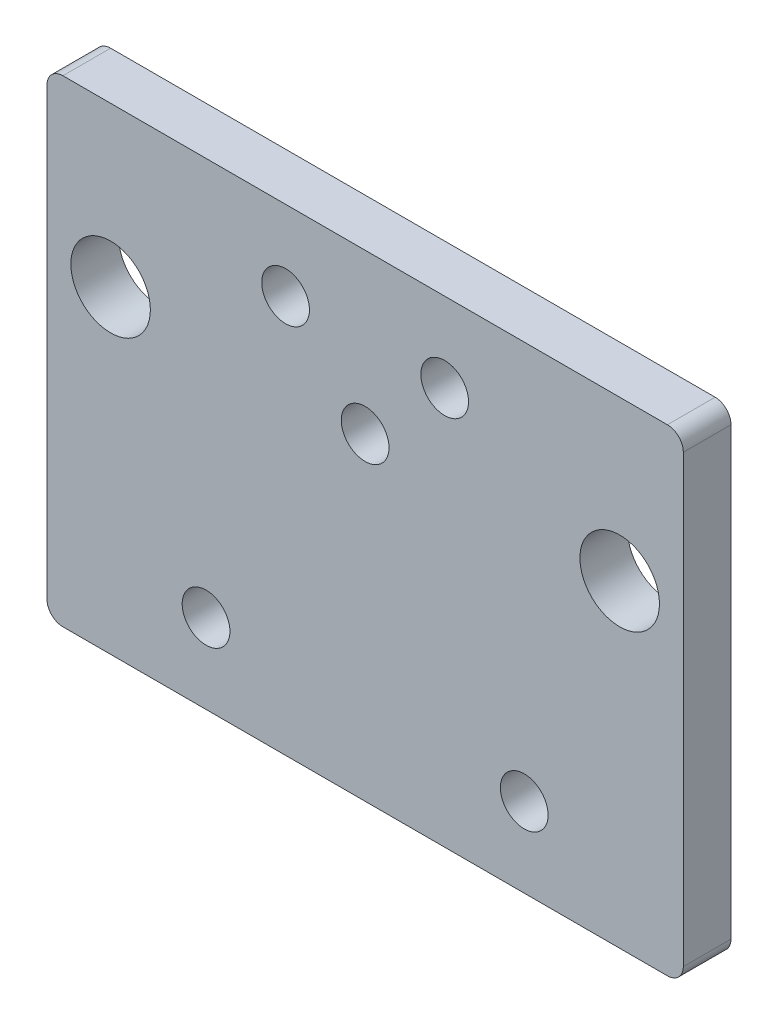
ISO-10303-21;
HEADER;
FILE_DESCRIPTION(('STEP AP214'),'2;1');
FILE_NAME('part.step','',(''),(''),'','','');
FILE_SCHEMA(('AUTOMOTIVE_DESIGN { 1 0 10303 214 1 1 1 1 }'));
ENDSEC;
DATA;
#1=APPLICATION_CONTEXT('core data for automotive mechanical design processes');
#2=APPLICATION_PROTOCOL_DEFINITION('international standard','automotive_design',2000,#1);
#3=PRODUCT_CONTEXT('',#1,'mechanical');
#4=PRODUCT('Part','Part','',(#3));
#5=PRODUCT_RELATED_PRODUCT_CATEGORY('part','',(#4));
#6=PRODUCT_DEFINITION_FORMATION('','',#4);
#7=PRODUCT_DEFINITION_CONTEXT('part definition',#1,'design');
#8=PRODUCT_DEFINITION('design','',#6,#7);
#9=PRODUCT_DEFINITION_SHAPE('','',#8);
#10=(LENGTH_UNIT() NAMED_UNIT(*) SI_UNIT(.MILLI.,.METRE.));
#11=(NAMED_UNIT(*) PLANE_ANGLE_UNIT() SI_UNIT($,.RADIAN.));
#12=(NAMED_UNIT(*) SI_UNIT($,.STERADIAN.) SOLID_ANGLE_UNIT());
#13=UNCERTAINTY_MEASURE_WITH_UNIT(LENGTH_MEASURE(1.E-05),#10,'distance_accuracy_value','');
#14=(GEOMETRIC_REPRESENTATION_CONTEXT(3) GLOBAL_UNCERTAINTY_ASSIGNED_CONTEXT((#13)) GLOBAL_UNIT_ASSIGNED_CONTEXT((#10,
#11,#12)) REPRESENTATION_CONTEXT('',''));
#15=CARTESIAN_POINT('',(0.,0.,0.));
#16=DIRECTION('',(0.,0.,1.));
#17=DIRECTION('',(1.,0.,0.));
#18=AXIS2_PLACEMENT_3D('',#15,#16,#17);
#19=CARTESIAN_POINT('',(0.,0.,3.));
#20=DIRECTION('',(0.,0.,1.));
#21=DIRECTION('',(1.,0.,0.));
#22=AXIS2_PLACEMENT_3D('',#19,#20,#21);
#23=PLANE('',#22);
#24=CARTESIAN_POINT('',(5.,5.,3.));
#25=DIRECTION('',(0.,0.,1.));
#26=DIRECTION('',(1.,0.,0.));
#27=AXIS2_PLACEMENT_3D('',#24,#25,#26);
#28=CIRCLE('',#27,1.5);
#29=CARTESIAN_POINT('',(6.5,5.,3.));
#30=VERTEX_POINT('',#29);
#31=EDGE_CURVE('E153',#30,#30,#28,.T.);
#32=ORIENTED_EDGE('',*,*,#31,.F.);
#33=EDGE_LOOP('',(#32));
#34=FACE_BOUND('',#33,.T.);
#35=CARTESIAN_POINT('',(-5.,5.,3.));
#36=DIRECTION('',(0.,0.,1.));
#37=DIRECTION('',(1.,0.,0.));
#38=AXIS2_PLACEMENT_3D('',#35,#36,#37);
#39=CIRCLE('',#38,1.5);
#40=CARTESIAN_POINT('',(-3.5,5.,3.));
#41=VERTEX_POINT('',#40);
#42=EDGE_CURVE('E150',#41,#41,#39,.T.);
#43=ORIENTED_EDGE('',*,*,#42,.F.);
#44=EDGE_LOOP('',(#43));
#45=FACE_BOUND('',#44,.T.);
#46=CARTESIAN_POINT('',(10.,-15.,3.));
#47=DIRECTION('',(0.,0.,1.));
#48=DIRECTION('',(1.,0.,0.));
#49=AXIS2_PLACEMENT_3D('',#46,#47,#48);
#50=CIRCLE('',#49,1.5);
#51=CARTESIAN_POINT('',(11.5,-15.,3.));
#52=VERTEX_POINT('',#51);
#53=EDGE_CURVE('E146',#52,#52,#50,.T.);
#54=ORIENTED_EDGE('',*,*,#53,.F.);
#55=EDGE_LOOP('',(#54));
#56=FACE_BOUND('',#55,.T.);
#57=CARTESIAN_POINT('',(-10.,-15.,3.));
#58=DIRECTION('',(0.,0.,1.));
#59=DIRECTION('',(1.,0.,0.));
#60=AXIS2_PLACEMENT_3D('',#57,#58,#59);
#61=CIRCLE('',#60,1.5);
#62=CARTESIAN_POINT('',(-8.5,-15.,3.));
#63=VERTEX_POINT('',#62);
#64=EDGE_CURVE('E142',#63,#63,#61,.T.);
#65=ORIENTED_EDGE('',*,*,#64,.F.);
#66=EDGE_LOOP('',(#65));
#67=FACE_BOUND('',#66,.T.);
#68=CARTESIAN_POINT('',(0.,0.,3.));
#69=DIRECTION('',(0.,0.,1.));
#70=DIRECTION('',(1.,0.,0.));
#71=AXIS2_PLACEMENT_3D('',#68,#69,#70);
#72=CIRCLE('',#71,1.5);
#73=CARTESIAN_POINT('',(1.5,0.,3.));
#74=VERTEX_POINT('',#73);
#75=EDGE_CURVE('E195',#74,#74,#72,.T.);
#76=ORIENTED_EDGE('',*,*,#75,.F.);
#77=EDGE_LOOP('',(#76));
#78=FACE_BOUND('',#77,.T.);
#79=CARTESIAN_POINT('',(-16.,0.,3.));
#80=DIRECTION('',(0.,0.,1.));
#81=DIRECTION('',(1.,0.,0.));
#82=AXIS2_PLACEMENT_3D('',#79,#80,#81);
#83=CIRCLE('',#82,2.5);
#84=CARTESIAN_POINT('',(-13.5,0.,3.));
#85=VERTEX_POINT('',#84);
#86=EDGE_CURVE('E127',#85,#85,#83,.T.);
#87=ORIENTED_EDGE('',*,*,#86,.F.);
#88=EDGE_LOOP('',(#87));
#89=FACE_BOUND('',#88,.T.);
#90=DIRECTION('',(0.,-1.,0.));
#91=VECTOR('',#90,1.);
#92=CARTESIAN_POINT('',(-20.,-10.,3.));
#93=LINE('',#92,#91);
#94=CARTESIAN_POINT('',(-20.,9.,3.));
#95=VERTEX_POINT('',#94);
#96=CARTESIAN_POINT('',(-20.,-19.,3.));
#97=VERTEX_POINT('',#96);
#98=EDGE_CURVE('E117',#95,#97,#93,.T.);
#99=ORIENTED_EDGE('',*,*,#98,.T.);
#100=CARTESIAN_POINT('',(-19.,-19.,3.));
#101=DIRECTION('',(0.,0.,1.));
#102=DIRECTION('',(1.,0.,0.));
#103=AXIS2_PLACEMENT_3D('',#100,#101,#102);
#104=CIRCLE('',#103,1.);
#105=CARTESIAN_POINT('',(-19.,-20.,3.));
#106=VERTEX_POINT('',#105);
#107=EDGE_CURVE('E162',#97,#106,#104,.T.);
#108=ORIENTED_EDGE('',*,*,#107,.T.);
#109=DIRECTION('',(1.,0.,0.));
#110=VECTOR('',#109,1.);
#111=CARTESIAN_POINT('',(-20.,-20.,3.));
#112=LINE('',#111,#110);
#113=CARTESIAN_POINT('',(19.,-20.,3.));
#114=VERTEX_POINT('',#113);
#115=EDGE_CURVE('E141',#106,#114,#112,.T.);
#116=ORIENTED_EDGE('',*,*,#115,.T.);
#117=CARTESIAN_POINT('',(19.,-19.,3.));
#118=DIRECTION('',(0.,0.,1.));
#119=DIRECTION('',(1.,0.,0.));
#120=AXIS2_PLACEMENT_3D('',#117,#118,#119);
#121=CIRCLE('',#120,1.);
#122=CARTESIAN_POINT('',(20.,-19.,3.));
#123=VERTEX_POINT('',#122);
#124=EDGE_CURVE('E160',#114,#123,#121,.T.);
#125=ORIENTED_EDGE('',*,*,#124,.T.);
#126=DIRECTION('',(0.,1.,0.));
#127=VECTOR('',#126,1.);
#128=CARTESIAN_POINT('',(20.,-10.,3.));
#129=LINE('',#128,#127);
#130=CARTESIAN_POINT('',(20.,9.,3.));
#131=VERTEX_POINT('',#130);
#132=EDGE_CURVE('E183',#123,#131,#129,.T.);
#133=ORIENTED_EDGE('',*,*,#132,.T.);
#134=CARTESIAN_POINT('',(19.,9.,3.));
#135=DIRECTION('',(0.,0.,1.));
#136=DIRECTION('',(1.,0.,0.));
#137=AXIS2_PLACEMENT_3D('',#134,#135,#136);
#138=CIRCLE('',#137,1.);
#139=CARTESIAN_POINT('',(19.,10.,3.));
#140=VERTEX_POINT('',#139);
#141=EDGE_CURVE('E158',#131,#140,#138,.T.);
#142=ORIENTED_EDGE('',*,*,#141,.T.);
#143=DIRECTION('',(-1.,0.,0.));
#144=VECTOR('',#143,1.);
#145=CARTESIAN_POINT('',(20.,10.,3.));
#146=LINE('',#145,#144);
#147=CARTESIAN_POINT('',(-19.,10.,3.));
#148=VERTEX_POINT('',#147);
#149=EDGE_CURVE('E119',#140,#148,#146,.T.);
#150=ORIENTED_EDGE('',*,*,#149,.T.);
#151=CARTESIAN_POINT('',(-19.,9.,3.));
#152=DIRECTION('',(0.,0.,1.));
#153=DIRECTION('',(1.,0.,0.));
#154=AXIS2_PLACEMENT_3D('',#151,#152,#153);
#155=CIRCLE('',#154,1.);
#156=EDGE_CURVE('E156',#148,#95,#155,.T.);
#157=ORIENTED_EDGE('',*,*,#156,.T.);
#158=EDGE_LOOP('',(#99,#108,#116,#125,#133,#142,#150,#157));
#159=FACE_BOUND('',#158,.T.);
#160=CARTESIAN_POINT('',(16.,0.,3.));
#161=DIRECTION('',(0.,0.,1.));
#162=DIRECTION('',(1.,0.,0.));
#163=AXIS2_PLACEMENT_3D('',#160,#161,#162);
#164=CIRCLE('',#163,2.5);
#165=CARTESIAN_POINT('',(18.5,0.,3.));
#166=VERTEX_POINT('',#165);
#167=EDGE_CURVE('E187',#166,#166,#164,.T.);
#168=ORIENTED_EDGE('',*,*,#167,.F.);
#169=EDGE_LOOP('',(#168));
#170=FACE_BOUND('',#169,.T.);
#171=ADVANCED_FACE('F35',(#34,#45,#56,#67,#78,#89,#159,#170),#23,.T.);
#172=CARTESIAN_POINT('',(0.,0.,0.));
#173=DIRECTION('',(0.,0.,1.));
#174=DIRECTION('',(1.,0.,0.));
#175=AXIS2_PLACEMENT_3D('',#172,#173,#174);
#176=PLANE('',#175);
#177=CARTESIAN_POINT('',(5.,5.,0.));
#178=DIRECTION('',(0.,0.,1.));
#179=DIRECTION('',(1.,0.,0.));
#180=AXIS2_PLACEMENT_3D('',#177,#178,#179);
#181=CIRCLE('',#180,1.5);
#182=CARTESIAN_POINT('',(6.5,5.,0.));
#183=VERTEX_POINT('',#182);
#184=EDGE_CURVE('E151',#183,#183,#181,.T.);
#185=ORIENTED_EDGE('',*,*,#184,.T.);
#186=EDGE_LOOP('',(#185));
#187=FACE_BOUND('',#186,.T.);
#188=CARTESIAN_POINT('',(-5.,5.,0.));
#189=DIRECTION('',(0.,0.,1.));
#190=DIRECTION('',(1.,0.,0.));
#191=AXIS2_PLACEMENT_3D('',#188,#189,#190);
#192=CIRCLE('',#191,1.5);
#193=CARTESIAN_POINT('',(-3.5,5.,0.));
#194=VERTEX_POINT('',#193);
#195=EDGE_CURVE('E147',#194,#194,#192,.T.);
#196=ORIENTED_EDGE('',*,*,#195,.T.);
#197=EDGE_LOOP('',(#196));
#198=FACE_BOUND('',#197,.T.);
#199=CARTESIAN_POINT('',(10.,-15.,0.));
#200=DIRECTION('',(0.,0.,1.));
#201=DIRECTION('',(1.,0.,0.));
#202=AXIS2_PLACEMENT_3D('',#199,#200,#201);
#203=CIRCLE('',#202,1.5);
#204=CARTESIAN_POINT('',(11.5,-15.,0.));
#205=VERTEX_POINT('',#204);
#206=EDGE_CURVE('E143',#205,#205,#203,.T.);
#207=ORIENTED_EDGE('',*,*,#206,.T.);
#208=EDGE_LOOP('',(#207));
#209=FACE_BOUND('',#208,.T.);
#210=CARTESIAN_POINT('',(-10.,-15.,0.));
#211=DIRECTION('',(0.,0.,1.));
#212=DIRECTION('',(1.,0.,0.));
#213=AXIS2_PLACEMENT_3D('',#210,#211,#212);
#214=CIRCLE('',#213,1.5);
#215=CARTESIAN_POINT('',(-8.5,-15.,0.));
#216=VERTEX_POINT('',#215);
#217=EDGE_CURVE('E138',#216,#216,#214,.T.);
#218=ORIENTED_EDGE('',*,*,#217,.T.);
#219=EDGE_LOOP('',(#218));
#220=FACE_BOUND('',#219,.T.);
#221=CARTESIAN_POINT('',(0.,0.,0.));
#222=DIRECTION('',(0.,0.,1.));
#223=DIRECTION('',(1.,0.,0.));
#224=AXIS2_PLACEMENT_3D('',#221,#222,#223);
#225=CIRCLE('',#224,1.5);
#226=CARTESIAN_POINT('',(1.5,0.,0.));
#227=VERTEX_POINT('',#226);
#228=EDGE_CURVE('E192',#227,#227,#225,.T.);
#229=ORIENTED_EDGE('',*,*,#228,.T.);
#230=EDGE_LOOP('',(#229));
#231=FACE_BOUND('',#230,.T.);
#232=DIRECTION('',(1.,0.,0.));
#233=VECTOR('',#232,1.);
#234=CARTESIAN_POINT('',(-20.,-20.,0.));
#235=LINE('',#234,#233);
#236=CARTESIAN_POINT('',(-19.,-20.,0.));
#237=VERTEX_POINT('',#236);
#238=CARTESIAN_POINT('',(19.,-20.,0.));
#239=VERTEX_POINT('',#238);
#240=EDGE_CURVE('E198',#237,#239,#235,.T.);
#241=ORIENTED_EDGE('',*,*,#240,.F.);
#242=CARTESIAN_POINT('',(-19.,-19.,0.));
#243=DIRECTION('',(0.,0.,1.));
#244=DIRECTION('',(1.,0.,0.));
#245=AXIS2_PLACEMENT_3D('',#242,#243,#244);
#246=CIRCLE('',#245,1.);
#247=CARTESIAN_POINT('',(-20.,-19.,0.));
#248=VERTEX_POINT('',#247);
#249=EDGE_CURVE('E125',#237,#248,#246,.F.);
#250=ORIENTED_EDGE('',*,*,#249,.T.);
#251=DIRECTION('',(0.,-1.,0.));
#252=VECTOR('',#251,1.);
#253=CARTESIAN_POINT('',(-20.,-10.,0.));
#254=LINE('',#253,#252);
#255=CARTESIAN_POINT('',(-20.,9.,0.));
#256=VERTEX_POINT('',#255);
#257=EDGE_CURVE('E114',#256,#248,#254,.T.);
#258=ORIENTED_EDGE('',*,*,#257,.F.);
#259=CARTESIAN_POINT('',(-19.,9.,0.));
#260=DIRECTION('',(0.,0.,1.));
#261=DIRECTION('',(1.,0.,0.));
#262=AXIS2_PLACEMENT_3D('',#259,#260,#261);
#263=CIRCLE('',#262,1.);
#264=CARTESIAN_POINT('',(-19.,10.,0.));
#265=VERTEX_POINT('',#264);
#266=EDGE_CURVE('E101',#256,#265,#263,.F.);
#267=ORIENTED_EDGE('',*,*,#266,.T.);
#268=DIRECTION('',(-1.,0.,0.));
#269=VECTOR('',#268,1.);
#270=CARTESIAN_POINT('',(20.,10.,0.));
#271=LINE('',#270,#269);
#272=CARTESIAN_POINT('',(19.,10.,0.));
#273=VERTEX_POINT('',#272);
#274=EDGE_CURVE('E129',#273,#265,#271,.T.);
#275=ORIENTED_EDGE('',*,*,#274,.F.);
#276=CARTESIAN_POINT('',(19.,9.,0.));
#277=DIRECTION('',(0.,0.,1.));
#278=DIRECTION('',(1.,0.,0.));
#279=AXIS2_PLACEMENT_3D('',#276,#277,#278);
#280=CIRCLE('',#279,1.);
#281=CARTESIAN_POINT('',(20.,9.,0.));
#282=VERTEX_POINT('',#281);
#283=EDGE_CURVE('E50',#273,#282,#280,.F.);
#284=ORIENTED_EDGE('',*,*,#283,.T.);
#285=DIRECTION('',(0.,1.,0.));
#286=VECTOR('',#285,1.);
#287=CARTESIAN_POINT('',(20.,-10.,0.));
#288=LINE('',#287,#286);
#289=CARTESIAN_POINT('',(20.,-19.,0.));
#290=VERTEX_POINT('',#289);
#291=EDGE_CURVE('E126',#290,#282,#288,.T.);
#292=ORIENTED_EDGE('',*,*,#291,.F.);
#293=CARTESIAN_POINT('',(19.,-19.,0.));
#294=DIRECTION('',(0.,0.,1.));
#295=DIRECTION('',(1.,0.,0.));
#296=AXIS2_PLACEMENT_3D('',#293,#294,#295);
#297=CIRCLE('',#296,1.);
#298=EDGE_CURVE('E169',#290,#239,#297,.F.);
#299=ORIENTED_EDGE('',*,*,#298,.T.);
#300=EDGE_LOOP('',(#241,#250,#258,#267,#275,#284,#292,#299));
#301=FACE_BOUND('',#300,.T.);
#302=CARTESIAN_POINT('',(-16.,0.,0.));
#303=DIRECTION('',(0.,0.,1.));
#304=DIRECTION('',(1.,0.,0.));
#305=AXIS2_PLACEMENT_3D('',#302,#303,#304);
#306=CIRCLE('',#305,2.5);
#307=CARTESIAN_POINT('',(-13.5,0.,0.));
#308=VERTEX_POINT('',#307);
#309=EDGE_CURVE('E132',#308,#308,#306,.T.);
#310=ORIENTED_EDGE('',*,*,#309,.T.);
#311=EDGE_LOOP('',(#310));
#312=FACE_BOUND('',#311,.T.);
#313=CARTESIAN_POINT('',(16.,0.,0.));
#314=DIRECTION('',(0.,0.,1.));
#315=DIRECTION('',(1.,0.,0.));
#316=AXIS2_PLACEMENT_3D('',#313,#314,#315);
#317=CIRCLE('',#316,2.5);
#318=CARTESIAN_POINT('',(18.5,0.,0.));
#319=VERTEX_POINT('',#318);
#320=EDGE_CURVE('E189',#319,#319,#317,.T.);
#321=ORIENTED_EDGE('',*,*,#320,.T.);
#322=EDGE_LOOP('',(#321));
#323=FACE_BOUND('',#322,.T.);
#324=ADVANCED_FACE('F122',(#187,#198,#209,#220,#231,#301,#312,#323),#176,.F.);
#325=CARTESIAN_POINT('',(-20.,-10.,3.));
#326=DIRECTION('',(1.,0.,0.));
#327=DIRECTION('',(0.,0.,-1.));
#328=AXIS2_PLACEMENT_3D('',#325,#326,#327);
#329=PLANE('',#328);
#330=ORIENTED_EDGE('',*,*,#257,.T.);
#331=DIRECTION('',(0.,0.,1.));
#332=VECTOR('',#331,1.);
#333=CARTESIAN_POINT('',(-20.,-19.,3.));
#334=LINE('',#333,#332);
#335=EDGE_CURVE('E118',#248,#97,#334,.T.);
#336=ORIENTED_EDGE('',*,*,#335,.T.);
#337=ORIENTED_EDGE('',*,*,#98,.F.);
#338=DIRECTION('',(0.,0.,-1.));
#339=VECTOR('',#338,1.);
#340=CARTESIAN_POINT('',(-20.,9.,3.));
#341=LINE('',#340,#339);
#342=EDGE_CURVE('E104',#95,#256,#341,.T.);
#343=ORIENTED_EDGE('',*,*,#342,.T.);
#344=EDGE_LOOP('',(#330,#336,#337,#343));
#345=FACE_BOUND('',#344,.T.);
#346=ADVANCED_FACE('F112',(#345),#329,.F.);
#347=CARTESIAN_POINT('',(20.,-10.,3.));
#348=DIRECTION('',(-1.,0.,0.));
#349=DIRECTION('',(0.,0.,1.));
#350=AXIS2_PLACEMENT_3D('',#347,#348,#349);
#351=PLANE('',#350);
#352=ORIENTED_EDGE('',*,*,#132,.F.);
#353=DIRECTION('',(0.,0.,1.));
#354=VECTOR('',#353,1.);
#355=CARTESIAN_POINT('',(20.,-19.,0.));
#356=LINE('',#355,#354);
#357=EDGE_CURVE('E57',#123,#290,#356,.F.);
#358=ORIENTED_EDGE('',*,*,#357,.T.);
#359=ORIENTED_EDGE('',*,*,#291,.T.);
#360=DIRECTION('',(0.,0.,-1.));
#361=VECTOR('',#360,1.);
#362=CARTESIAN_POINT('',(20.,9.,3.));
#363=LINE('',#362,#361);
#364=EDGE_CURVE('E172',#282,#131,#363,.F.);
#365=ORIENTED_EDGE('',*,*,#364,.T.);
#366=EDGE_LOOP('',(#352,#358,#359,#365));
#367=FACE_BOUND('',#366,.T.);
#368=ADVANCED_FACE('F256',(#367),#351,.F.);
#369=CARTESIAN_POINT('',(20.,10.,3.));
#370=DIRECTION('',(0.,-1.,0.));
#371=DIRECTION('',(1.,0.,0.));
#372=AXIS2_PLACEMENT_3D('',#369,#370,#371);
#373=PLANE('',#372);
#374=ORIENTED_EDGE('',*,*,#149,.F.);
#375=DIRECTION('',(0.,0.,-1.));
#376=VECTOR('',#375,1.);
#377=CARTESIAN_POINT('',(19.,10.,3.));
#378=LINE('',#377,#376);
#379=EDGE_CURVE('E11',#140,#273,#378,.T.);
#380=ORIENTED_EDGE('',*,*,#379,.T.);
#381=ORIENTED_EDGE('',*,*,#274,.T.);
#382=DIRECTION('',(0.,0.,-1.));
#383=VECTOR('',#382,1.);
#384=CARTESIAN_POINT('',(-19.,10.,3.));
#385=LINE('',#384,#383);
#386=EDGE_CURVE('E43',#265,#148,#385,.F.);
#387=ORIENTED_EDGE('',*,*,#386,.T.);
#388=EDGE_LOOP('',(#374,#380,#381,#387));
#389=FACE_BOUND('',#388,.T.);
#390=ADVANCED_FACE('F177',(#389),#373,.F.);
#391=CARTESIAN_POINT('',(-16.,0.,3.));
#392=DIRECTION('',(0.,0.,-1.));
#393=DIRECTION('',(-1.,0.,0.));
#394=AXIS2_PLACEMENT_3D('',#391,#392,#393);
#395=CYLINDRICAL_SURFACE('',#394,2.5);
#396=ORIENTED_EDGE('',*,*,#86,.T.);
#397=EDGE_LOOP('',(#396));
#398=FACE_BOUND('',#397,.T.);
#399=ORIENTED_EDGE('',*,*,#309,.F.);
#400=EDGE_LOOP('',(#399));
#401=FACE_BOUND('',#400,.T.);
#402=ADVANCED_FACE('F230',(#398,#401),#395,.F.);
#403=CARTESIAN_POINT('',(16.,0.,3.));
#404=DIRECTION('',(0.,0.,-1.));
#405=DIRECTION('',(-1.,0.,0.));
#406=AXIS2_PLACEMENT_3D('',#403,#404,#405);
#407=CYLINDRICAL_SURFACE('',#406,2.5);
#408=ORIENTED_EDGE('',*,*,#167,.T.);
#409=EDGE_LOOP('',(#408));
#410=FACE_BOUND('',#409,.T.);
#411=ORIENTED_EDGE('',*,*,#320,.F.);
#412=EDGE_LOOP('',(#411));
#413=FACE_BOUND('',#412,.T.);
#414=ADVANCED_FACE('F233',(#410,#413),#407,.F.);
#415=CARTESIAN_POINT('',(0.,0.,0.));
#416=DIRECTION('',(0.,0.,1.));
#417=DIRECTION('',(1.,0.,0.));
#418=AXIS2_PLACEMENT_3D('',#415,#416,#417);
#419=CYLINDRICAL_SURFACE('',#418,1.5);
#420=ORIENTED_EDGE('',*,*,#228,.F.);
#421=EDGE_LOOP('',(#420));
#422=FACE_BOUND('',#421,.T.);
#423=ORIENTED_EDGE('',*,*,#75,.T.);
#424=EDGE_LOOP('',(#423));
#425=FACE_BOUND('',#424,.T.);
#426=ADVANCED_FACE('F243',(#422,#425),#419,.F.);
#427=CARTESIAN_POINT('',(-20.,-20.,0.));
#428=DIRECTION('',(0.,-1.,0.));
#429=DIRECTION('',(0.,0.,-1.));
#430=AXIS2_PLACEMENT_3D('',#427,#428,#429);
#431=PLANE('',#430);
#432=ORIENTED_EDGE('',*,*,#115,.F.);
#433=DIRECTION('',(0.,0.,1.));
#434=VECTOR('',#433,1.);
#435=CARTESIAN_POINT('',(-19.,-20.,0.));
#436=LINE('',#435,#434);
#437=EDGE_CURVE('E107',#106,#237,#436,.F.);
#438=ORIENTED_EDGE('',*,*,#437,.T.);
#439=ORIENTED_EDGE('',*,*,#240,.T.);
#440=DIRECTION('',(0.,0.,1.));
#441=VECTOR('',#440,1.);
#442=CARTESIAN_POINT('',(19.,-20.,3.));
#443=LINE('',#442,#441);
#444=EDGE_CURVE('E164',#239,#114,#443,.T.);
#445=ORIENTED_EDGE('',*,*,#444,.T.);
#446=EDGE_LOOP('',(#432,#438,#439,#445));
#447=FACE_BOUND('',#446,.T.);
#448=ADVANCED_FACE('F249',(#447),#431,.T.);
#449=CARTESIAN_POINT('',(-10.,-15.,-7.));
#450=DIRECTION('',(0.,0.,1.));
#451=DIRECTION('',(1.,0.,0.));
#452=AXIS2_PLACEMENT_3D('',#449,#450,#451);
#453=CYLINDRICAL_SURFACE('',#452,1.5);
#454=ORIENTED_EDGE('',*,*,#64,.T.);
#455=EDGE_LOOP('',(#454));
#456=FACE_BOUND('',#455,.T.);
#457=ORIENTED_EDGE('',*,*,#217,.F.);
#458=EDGE_LOOP('',(#457));
#459=FACE_BOUND('',#458,.T.);
#460=ADVANCED_FACE('F281',(#456,#459),#453,.F.);
#461=CARTESIAN_POINT('',(10.,-15.,-7.));
#462=DIRECTION('',(0.,0.,1.));
#463=DIRECTION('',(1.,0.,0.));
#464=AXIS2_PLACEMENT_3D('',#461,#462,#463);
#465=CYLINDRICAL_SURFACE('',#464,1.5);
#466=ORIENTED_EDGE('',*,*,#53,.T.);
#467=EDGE_LOOP('',(#466));
#468=FACE_BOUND('',#467,.T.);
#469=ORIENTED_EDGE('',*,*,#206,.F.);
#470=EDGE_LOOP('',(#469));
#471=FACE_BOUND('',#470,.T.);
#472=ADVANCED_FACE('F286',(#468,#471),#465,.F.);
#473=CARTESIAN_POINT('',(-5.,5.,-7.));
#474=DIRECTION('',(0.,0.,1.));
#475=DIRECTION('',(1.,0.,0.));
#476=AXIS2_PLACEMENT_3D('',#473,#474,#475);
#477=CYLINDRICAL_SURFACE('',#476,1.5);
#478=ORIENTED_EDGE('',*,*,#42,.T.);
#479=EDGE_LOOP('',(#478));
#480=FACE_BOUND('',#479,.T.);
#481=ORIENTED_EDGE('',*,*,#195,.F.);
#482=EDGE_LOOP('',(#481));
#483=FACE_BOUND('',#482,.T.);
#484=ADVANCED_FACE('F292',(#480,#483),#477,.F.);
#485=CARTESIAN_POINT('',(5.,5.,-7.));
#486=DIRECTION('',(0.,0.,1.));
#487=DIRECTION('',(1.,0.,0.));
#488=AXIS2_PLACEMENT_3D('',#485,#486,#487);
#489=CYLINDRICAL_SURFACE('',#488,1.5);
#490=ORIENTED_EDGE('',*,*,#31,.T.);
#491=EDGE_LOOP('',(#490));
#492=FACE_BOUND('',#491,.T.);
#493=ORIENTED_EDGE('',*,*,#184,.F.);
#494=EDGE_LOOP('',(#493));
#495=FACE_BOUND('',#494,.T.);
#496=ADVANCED_FACE('F214',(#492,#495),#489,.F.);
#497=CARTESIAN_POINT('',(-19.,-19.,3.));
#498=DIRECTION('',(0.,0.,-1.));
#499=DIRECTION('',(-1.,0.,0.));
#500=AXIS2_PLACEMENT_3D('',#497,#498,#499);
#501=CYLINDRICAL_SURFACE('',#500,1.);
#502=ORIENTED_EDGE('',*,*,#249,.F.);
#503=ORIENTED_EDGE('',*,*,#437,.F.);
#504=ORIENTED_EDGE('',*,*,#107,.F.);
#505=ORIENTED_EDGE('',*,*,#335,.F.);
#506=EDGE_LOOP('',(#502,#503,#504,#505));
#507=FACE_BOUND('',#506,.T.);
#508=ADVANCED_FACE('F261',(#507),#501,.T.);
#509=CARTESIAN_POINT('',(19.,-19.,0.));
#510=DIRECTION('',(0.,0.,-1.));
#511=DIRECTION('',(-1.,0.,0.));
#512=AXIS2_PLACEMENT_3D('',#509,#510,#511);
#513=CYLINDRICAL_SURFACE('',#512,1.);
#514=ORIENTED_EDGE('',*,*,#298,.F.);
#515=ORIENTED_EDGE('',*,*,#357,.F.);
#516=ORIENTED_EDGE('',*,*,#124,.F.);
#517=ORIENTED_EDGE('',*,*,#444,.F.);
#518=EDGE_LOOP('',(#514,#515,#516,#517));
#519=FACE_BOUND('',#518,.T.);
#520=ADVANCED_FACE('F264',(#519),#513,.T.);
#521=CARTESIAN_POINT('',(19.,9.,3.));
#522=DIRECTION('',(0.,0.,-1.));
#523=DIRECTION('',(-1.,0.,0.));
#524=AXIS2_PLACEMENT_3D('',#521,#522,#523);
#525=CYLINDRICAL_SURFACE('',#524,1.);
#526=ORIENTED_EDGE('',*,*,#141,.F.);
#527=ORIENTED_EDGE('',*,*,#364,.F.);
#528=ORIENTED_EDGE('',*,*,#283,.F.);
#529=ORIENTED_EDGE('',*,*,#379,.F.);
#530=EDGE_LOOP('',(#526,#527,#528,#529));
#531=FACE_BOUND('',#530,.T.);
#532=ADVANCED_FACE('F267',(#531),#525,.T.);
#533=CARTESIAN_POINT('',(-19.,9.,3.));
#534=DIRECTION('',(0.,0.,-1.));
#535=DIRECTION('',(-1.,0.,0.));
#536=AXIS2_PLACEMENT_3D('',#533,#534,#535);
#537=CYLINDRICAL_SURFACE('',#536,1.);
#538=ORIENTED_EDGE('',*,*,#156,.F.);
#539=ORIENTED_EDGE('',*,*,#386,.F.);
#540=ORIENTED_EDGE('',*,*,#266,.F.);
#541=ORIENTED_EDGE('',*,*,#342,.F.);
#542=EDGE_LOOP('',(#538,#539,#540,#541));
#543=FACE_BOUND('',#542,.T.);
#544=ADVANCED_FACE('F37',(#543),#537,.T.);
#545=CLOSED_SHELL('',(#171,#324,#346,#368,#390,#402,#414,#426,#448,#460,#472,#484,#496,#508,
#520,#532,#544));
#546=MANIFOLD_SOLID_BREP('B2',#545);
#547=ADVANCED_BREP_SHAPE_REPRESENTATION('',(#18,#546),#14);
#548=SHAPE_DEFINITION_REPRESENTATION(#9,#547);
ENDSEC;
END-ISO-10303-21;
